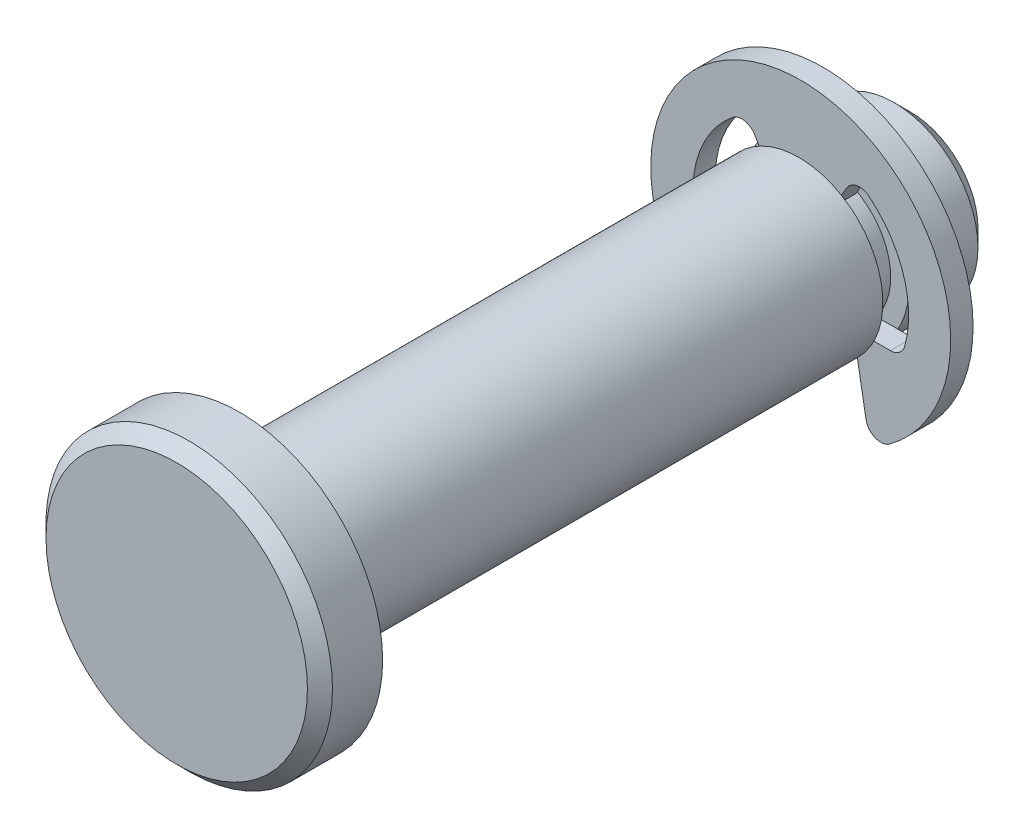
ISO-10303-21;
HEADER;
FILE_DESCRIPTION(('STEP AP214'),'2;1');
FILE_NAME('part.step','',(''),(''),'','','');
FILE_SCHEMA(('AUTOMOTIVE_DESIGN { 1 0 10303 214 1 1 1 1 }'));
ENDSEC;
DATA;
#1=APPLICATION_CONTEXT('core data for automotive mechanical design processes');
#2=APPLICATION_PROTOCOL_DEFINITION('international standard','automotive_design',2000,#1);
#3=PRODUCT_CONTEXT('',#1,'mechanical');
#4=PRODUCT('Part','Part','',(#3));
#5=PRODUCT_RELATED_PRODUCT_CATEGORY('part','',(#4));
#6=PRODUCT_DEFINITION_FORMATION('','',#4);
#7=PRODUCT_DEFINITION_CONTEXT('part definition',#1,'design');
#8=PRODUCT_DEFINITION('design','',#6,#7);
#9=PRODUCT_DEFINITION_SHAPE('','',#8);
#10=(LENGTH_UNIT() NAMED_UNIT(*) SI_UNIT(.MILLI.,.METRE.));
#11=(NAMED_UNIT(*) PLANE_ANGLE_UNIT() SI_UNIT($,.RADIAN.));
#12=(NAMED_UNIT(*) SI_UNIT($,.STERADIAN.) SOLID_ANGLE_UNIT());
#13=UNCERTAINTY_MEASURE_WITH_UNIT(LENGTH_MEASURE(1.E-05),#10,'distance_accuracy_value','');
#14=(GEOMETRIC_REPRESENTATION_CONTEXT(3) GLOBAL_UNCERTAINTY_ASSIGNED_CONTEXT((#13)) GLOBAL_UNIT_ASSIGNED_CONTEXT((#10,
#11,#12)) REPRESENTATION_CONTEXT('',''));
#15=CARTESIAN_POINT('',(0.,0.,0.));
#16=DIRECTION('',(0.,0.,1.));
#17=DIRECTION('',(1.,0.,0.));
#18=AXIS2_PLACEMENT_3D('',#15,#16,#17);
#19=CARTESIAN_POINT('',(0.,0.,-6.4008));
#20=DIRECTION('',(0.,0.,1.));
#21=DIRECTION('',(1.,0.,0.));
#22=AXIS2_PLACEMENT_3D('',#19,#20,#21);
#23=PLANE('',#22);
#24=DIRECTION('',(-0.173648177666931,0.984807753012208,0.));
#25=VECTOR('',#24,1.);
#26=CARTESIAN_POINT('',(1.25692963982568,0.22163060835344,-6.4008));
#27=LINE('',#26,#25);
#28=CARTESIAN_POINT('',(1.85256069501915,-3.15636096616503,-6.4008));
#29=VERTEX_POINT('',#28);
#30=CARTESIAN_POINT('',(1.49352,-1.12014,-6.4008));
#31=VERTEX_POINT('',#30);
#32=EDGE_CURVE('E203',#29,#31,#27,.T.);
#33=ORIENTED_EDGE('',*,*,#32,.F.);
#34=CARTESIAN_POINT('',(2.2715471535382,-3.08248234897663,-6.4008));
#35=DIRECTION('',(0.,0.,1.));
#36=DIRECTION('',(1.,0.,0.));
#37=AXIS2_PLACEMENT_3D('',#34,#35,#36);
#38=CIRCLE('',#37,0.42545);
#39=CARTESIAN_POINT('',(2.52394128170911,-3.42498038775182,-6.4008));
#40=VERTEX_POINT('',#39);
#41=EDGE_CURVE('E257',#29,#40,#38,.T.);
#42=ORIENTED_EDGE('',*,*,#41,.T.);
#43=CARTESIAN_POINT('',(0.,0.,-6.4008));
#44=DIRECTION('',(0.,0.,1.));
#45=DIRECTION('',(1.,0.,0.));
#46=AXIS2_PLACEMENT_3D('',#43,#44,#45);
#47=CIRCLE('',#46,4.2545);
#48=CARTESIAN_POINT('',(-2.52394128170911,-3.42498038775182,-6.4008));
#49=VERTEX_POINT('',#48);
#50=EDGE_CURVE('E183',#40,#49,#47,.T.);
#51=ORIENTED_EDGE('',*,*,#50,.T.);
#52=CARTESIAN_POINT('',(-2.2715471535382,-3.08248234897663,-6.4008));
#53=DIRECTION('',(0.,0.,1.));
#54=DIRECTION('',(1.,0.,0.));
#55=AXIS2_PLACEMENT_3D('',#52,#53,#54);
#56=CIRCLE('',#55,0.42545);
#57=CARTESIAN_POINT('',(-1.85256069501915,-3.15636096616503,-6.4008));
#58=VERTEX_POINT('',#57);
#59=EDGE_CURVE('E255',#49,#58,#56,.T.);
#60=ORIENTED_EDGE('',*,*,#59,.T.);
#61=DIRECTION('',(-0.173648177666931,-0.984807753012208,0.));
#62=VECTOR('',#61,1.);
#63=CARTESIAN_POINT('',(-1.25692963982568,0.22163060835344,-6.4008));
#64=LINE('',#63,#62);
#65=CARTESIAN_POINT('',(-1.49352,-1.12014,-6.4008));
#66=VERTEX_POINT('',#65);
#67=EDGE_CURVE('E199',#66,#58,#64,.T.);
#68=ORIENTED_EDGE('',*,*,#67,.F.);
#69=DIRECTION('',(1.,0.,0.));
#70=VECTOR('',#69,1.);
#71=CARTESIAN_POINT('',(0.,-1.12014,-6.4008));
#72=LINE('',#71,#70);
#73=CARTESIAN_POINT('',(-2.54203626378539,-1.12014,-6.4008));
#74=VERTEX_POINT('',#73);
#75=EDGE_CURVE('E190',#74,#66,#72,.T.);
#76=ORIENTED_EDGE('',*,*,#75,.F.);
#77=CARTESIAN_POINT('',(-2.54203626378539,-0.69469,-6.4008));
#78=DIRECTION('',(0.,0.,1.));
#79=DIRECTION('',(1.,0.,0.));
#80=AXIS2_PLACEMENT_3D('',#77,#78,#79);
#81=CIRCLE('',#80,0.42545);
#82=CARTESIAN_POINT('',(-2.95243729914352,-0.806844771084337,-6.4008));
#83=VERTEX_POINT('',#82);
#84=EDGE_CURVE('E55',#74,#83,#81,.F.);
#85=ORIENTED_EDGE('',*,*,#84,.T.);
#86=CARTESIAN_POINT('',(0.,0.,-6.4008));
#87=DIRECTION('',(0.,0.,1.));
#88=DIRECTION('',(1.,0.,0.));
#89=AXIS2_PLACEMENT_3D('',#86,#87,#88);
#90=CIRCLE('',#89,3.0607);
#91=CARTESIAN_POINT('',(-1.93820951958955,2.36880314677528,-6.4008));
#92=VERTEX_POINT('',#91);
#93=EDGE_CURVE('E215',#92,#83,#90,.T.);
#94=ORIENTED_EDGE('',*,*,#93,.F.);
#95=CARTESIAN_POINT('',(-1.66879035400345,2.03952968031481,-6.4008));
#96=DIRECTION('',(0.,0.,1.));
#97=DIRECTION('',(1.,0.,0.));
#98=AXIS2_PLACEMENT_3D('',#95,#96,#97);
#99=CIRCLE('',#98,0.42545);
#100=CARTESIAN_POINT('',(-1.30033984596336,2.25225468031482,-6.4008));
#101=VERTEX_POINT('',#100);
#102=EDGE_CURVE('E187',#92,#101,#99,.F.);
#103=ORIENTED_EDGE('',*,*,#102,.T.);
#104=DIRECTION('',(-0.500000000000002,0.866025403784438,0.));
#105=VECTOR('',#104,1.);
#106=CARTESIAN_POINT('',(0.,0.,-6.4008));
#107=LINE('',#106,#105);
#108=CARTESIAN_POINT('',(-0.933450000000003,1.61678282632517,-6.4008));
#109=VERTEX_POINT('',#108);
#110=EDGE_CURVE('E179',#109,#101,#107,.T.);
#111=ORIENTED_EDGE('',*,*,#110,.F.);
#112=DIRECTION('',(1.,0.,0.));
#113=VECTOR('',#112,1.);
#114=CARTESIAN_POINT('',(-0.933450000000003,1.61678282632517,-6.4008));
#115=LINE('',#114,#113);
#116=CARTESIAN_POINT('',(0.933450000000003,1.61678282632517,-6.4008));
#117=VERTEX_POINT('',#116);
#118=EDGE_CURVE('E163',#109,#117,#115,.T.);
#119=ORIENTED_EDGE('',*,*,#118,.T.);
#120=DIRECTION('',(-0.500000000000002,-0.866025403784438,0.));
#121=VECTOR('',#120,1.);
#122=CARTESIAN_POINT('',(0.,0.,-6.4008));
#123=LINE('',#122,#121);
#124=CARTESIAN_POINT('',(1.30033984596336,2.25225468031482,-6.4008));
#125=VERTEX_POINT('',#124);
#126=EDGE_CURVE('E213',#125,#117,#123,.T.);
#127=ORIENTED_EDGE('',*,*,#126,.F.);
#128=CARTESIAN_POINT('',(1.66879035400345,2.03952968031481,-6.4008));
#129=DIRECTION('',(0.,0.,1.));
#130=DIRECTION('',(1.,0.,0.));
#131=AXIS2_PLACEMENT_3D('',#128,#129,#130);
#132=CIRCLE('',#131,0.42545);
#133=CARTESIAN_POINT('',(1.93820951958955,2.36880314677528,-6.4008));
#134=VERTEX_POINT('',#133);
#135=EDGE_CURVE('E272',#125,#134,#132,.F.);
#136=ORIENTED_EDGE('',*,*,#135,.T.);
#137=CARTESIAN_POINT('',(0.,0.,-6.4008));
#138=DIRECTION('',(0.,0.,1.));
#139=DIRECTION('',(1.,0.,0.));
#140=AXIS2_PLACEMENT_3D('',#137,#138,#139);
#141=CIRCLE('',#140,3.0607);
#142=CARTESIAN_POINT('',(2.95243729914352,-0.806844771084337,-6.4008));
#143=VERTEX_POINT('',#142);
#144=EDGE_CURVE('E218',#143,#134,#141,.T.);
#145=ORIENTED_EDGE('',*,*,#144,.F.);
#146=CARTESIAN_POINT('',(2.54203626378539,-0.69469,-6.4008));
#147=DIRECTION('',(0.,0.,1.));
#148=DIRECTION('',(1.,0.,0.));
#149=AXIS2_PLACEMENT_3D('',#146,#147,#148);
#150=CIRCLE('',#149,0.42545);
#151=CARTESIAN_POINT('',(2.54203626378539,-1.12014,-6.4008));
#152=VERTEX_POINT('',#151);
#153=EDGE_CURVE('E268',#143,#152,#150,.F.);
#154=ORIENTED_EDGE('',*,*,#153,.T.);
#155=DIRECTION('',(1.,0.,0.));
#156=VECTOR('',#155,1.);
#157=CARTESIAN_POINT('',(0.,-1.12014,-6.4008));
#158=LINE('',#157,#156);
#159=EDGE_CURVE('E208',#31,#152,#158,.T.);
#160=ORIENTED_EDGE('',*,*,#159,.F.);
#161=EDGE_LOOP('',(#33,#42,#51,#60,#68,#76,#85,#94,#103,#111,#119,#127,#136,#145,#154,#160));
#162=FACE_BOUND('',#161,.T.);
#163=ADVANCED_FACE('F47',(#162),#23,.T.);
#164=CARTESIAN_POINT('',(0.,0.,-7.0358));
#165=DIRECTION('',(0.,0.,1.));
#166=DIRECTION('',(1.,0.,0.));
#167=AXIS2_PLACEMENT_3D('',#164,#165,#166);
#168=PLANE('',#167);
#169=CARTESIAN_POINT('',(0.,0.,-7.0358));
#170=DIRECTION('',(0.,0.,1.));
#171=DIRECTION('',(1.,0.,0.));
#172=AXIS2_PLACEMENT_3D('',#169,#170,#171);
#173=CIRCLE('',#172,4.2545);
#174=CARTESIAN_POINT('',(2.52394128170911,-3.42498038775182,-7.0358));
#175=VERTEX_POINT('',#174);
#176=CARTESIAN_POINT('',(-2.52394128170911,-3.42498038775182,-7.0358));
#177=VERTEX_POINT('',#176);
#178=EDGE_CURVE('E221',#175,#177,#173,.T.);
#179=ORIENTED_EDGE('',*,*,#178,.F.);
#180=CARTESIAN_POINT('',(2.2715471535382,-3.08248234897663,-7.0358));
#181=DIRECTION('',(0.,0.,1.));
#182=DIRECTION('',(1.,0.,0.));
#183=AXIS2_PLACEMENT_3D('',#180,#181,#182);
#184=CIRCLE('',#183,0.42545);
#185=CARTESIAN_POINT('',(1.85256069501915,-3.15636096616503,-7.0358));
#186=VERTEX_POINT('',#185);
#187=EDGE_CURVE('E265',#175,#186,#184,.F.);
#188=ORIENTED_EDGE('',*,*,#187,.T.);
#189=DIRECTION('',(-0.173648177666931,0.984807753012208,0.));
#190=VECTOR('',#189,1.);
#191=CARTESIAN_POINT('',(1.25692963982568,0.22163060835344,-7.0358));
#192=LINE('',#191,#190);
#193=CARTESIAN_POINT('',(1.49352,-1.12014,-7.0358));
#194=VERTEX_POINT('',#193);
#195=EDGE_CURVE('E201',#186,#194,#192,.T.);
#196=ORIENTED_EDGE('',*,*,#195,.T.);
#197=DIRECTION('',(1.,0.,0.));
#198=VECTOR('',#197,1.);
#199=CARTESIAN_POINT('',(0.,-1.12014,-7.0358));
#200=LINE('',#199,#198);
#201=CARTESIAN_POINT('',(2.54203626378539,-1.12014,-7.0358));
#202=VERTEX_POINT('',#201);
#203=EDGE_CURVE('E205',#194,#202,#200,.T.);
#204=ORIENTED_EDGE('',*,*,#203,.T.);
#205=CARTESIAN_POINT('',(2.54203626378539,-0.69469,-7.0358));
#206=DIRECTION('',(0.,0.,1.));
#207=DIRECTION('',(1.,0.,0.));
#208=AXIS2_PLACEMENT_3D('',#205,#206,#207);
#209=CIRCLE('',#208,0.42545);
#210=CARTESIAN_POINT('',(2.95243729914352,-0.806844771084337,-7.0358));
#211=VERTEX_POINT('',#210);
#212=EDGE_CURVE('E270',#202,#211,#209,.T.);
#213=ORIENTED_EDGE('',*,*,#212,.T.);
#214=CARTESIAN_POINT('',(0.,0.,-7.0358));
#215=DIRECTION('',(0.,0.,1.));
#216=DIRECTION('',(1.,0.,0.));
#217=AXIS2_PLACEMENT_3D('',#214,#215,#216);
#218=CIRCLE('',#217,3.0607);
#219=CARTESIAN_POINT('',(1.93820951958955,2.36880314677528,-7.0358));
#220=VERTEX_POINT('',#219);
#221=EDGE_CURVE('E229',#211,#220,#218,.T.);
#222=ORIENTED_EDGE('',*,*,#221,.T.);
#223=CARTESIAN_POINT('',(1.66879035400345,2.03952968031481,-7.0358));
#224=DIRECTION('',(0.,0.,1.));
#225=DIRECTION('',(1.,0.,0.));
#226=AXIS2_PLACEMENT_3D('',#223,#224,#225);
#227=CIRCLE('',#226,0.42545);
#228=CARTESIAN_POINT('',(1.30033984596336,2.25225468031482,-7.0358));
#229=VERTEX_POINT('',#228);
#230=EDGE_CURVE('E274',#220,#229,#227,.T.);
#231=ORIENTED_EDGE('',*,*,#230,.T.);
#232=DIRECTION('',(-0.500000000000002,-0.866025403784438,0.));
#233=VECTOR('',#232,1.);
#234=CARTESIAN_POINT('',(0.,0.,-7.0358));
#235=LINE('',#234,#233);
#236=CARTESIAN_POINT('',(0.933450000000003,1.61678282632517,-7.0358));
#237=VERTEX_POINT('',#236);
#238=EDGE_CURVE('E211',#229,#237,#235,.T.);
#239=ORIENTED_EDGE('',*,*,#238,.T.);
#240=DIRECTION('',(-1.,0.,0.));
#241=VECTOR('',#240,1.);
#242=CARTESIAN_POINT('',(-0.933450000000003,1.61678282632517,-7.0358));
#243=LINE('',#242,#241);
#244=CARTESIAN_POINT('',(-0.933450000000003,1.61678282632517,-7.0358));
#245=VERTEX_POINT('',#244);
#246=EDGE_CURVE('E174',#237,#245,#243,.T.);
#247=ORIENTED_EDGE('',*,*,#246,.T.);
#248=DIRECTION('',(-0.500000000000002,0.866025403784438,0.));
#249=VECTOR('',#248,1.);
#250=CARTESIAN_POINT('',(0.,0.,-7.0358));
#251=LINE('',#250,#249);
#252=CARTESIAN_POINT('',(-1.30033984596336,2.25225468031482,-7.0358));
#253=VERTEX_POINT('',#252);
#254=EDGE_CURVE('E182',#245,#253,#251,.T.);
#255=ORIENTED_EDGE('',*,*,#254,.T.);
#256=CARTESIAN_POINT('',(-1.66879035400345,2.03952968031481,-7.0358));
#257=DIRECTION('',(0.,0.,1.));
#258=DIRECTION('',(1.,0.,0.));
#259=AXIS2_PLACEMENT_3D('',#256,#257,#258);
#260=CIRCLE('',#259,0.42545);
#261=CARTESIAN_POINT('',(-1.93820951958955,2.36880314677528,-7.0358));
#262=VERTEX_POINT('',#261);
#263=EDGE_CURVE('E277',#253,#262,#260,.T.);
#264=ORIENTED_EDGE('',*,*,#263,.T.);
#265=CARTESIAN_POINT('',(0.,0.,-7.0358));
#266=DIRECTION('',(0.,0.,1.));
#267=DIRECTION('',(1.,0.,0.));
#268=AXIS2_PLACEMENT_3D('',#265,#266,#267);
#269=CIRCLE('',#268,3.0607);
#270=CARTESIAN_POINT('',(-2.95243729914352,-0.806844771084337,-7.0358));
#271=VERTEX_POINT('',#270);
#272=EDGE_CURVE('E226',#262,#271,#269,.T.);
#273=ORIENTED_EDGE('',*,*,#272,.T.);
#274=CARTESIAN_POINT('',(-2.54203626378539,-0.69469,-7.0358));
#275=DIRECTION('',(0.,0.,1.));
#276=DIRECTION('',(1.,0.,0.));
#277=AXIS2_PLACEMENT_3D('',#274,#275,#276);
#278=CIRCLE('',#277,0.42545);
#279=CARTESIAN_POINT('',(-2.54203626378539,-1.12014,-7.0358));
#280=VERTEX_POINT('',#279);
#281=EDGE_CURVE('E12',#271,#280,#278,.T.);
#282=ORIENTED_EDGE('',*,*,#281,.T.);
#283=DIRECTION('',(1.,0.,0.));
#284=VECTOR('',#283,1.);
#285=CARTESIAN_POINT('',(0.,-1.12014,-7.0358));
#286=LINE('',#285,#284);
#287=CARTESIAN_POINT('',(-1.49352,-1.12014,-7.0358));
#288=VERTEX_POINT('',#287);
#289=EDGE_CURVE('E188',#280,#288,#286,.T.);
#290=ORIENTED_EDGE('',*,*,#289,.T.);
#291=DIRECTION('',(-0.173648177666931,-0.984807753012208,0.));
#292=VECTOR('',#291,1.);
#293=CARTESIAN_POINT('',(-1.25692963982568,0.22163060835344,-7.0358));
#294=LINE('',#293,#292);
#295=CARTESIAN_POINT('',(-1.85256069501915,-3.15636096616503,-7.0358));
#296=VERTEX_POINT('',#295);
#297=EDGE_CURVE('E197',#288,#296,#294,.T.);
#298=ORIENTED_EDGE('',*,*,#297,.T.);
#299=CARTESIAN_POINT('',(-2.2715471535382,-3.08248234897663,-7.0358));
#300=DIRECTION('',(0.,0.,1.));
#301=DIRECTION('',(1.,0.,0.));
#302=AXIS2_PLACEMENT_3D('',#299,#300,#301);
#303=CIRCLE('',#302,0.42545);
#304=EDGE_CURVE('E69',#296,#177,#303,.F.);
#305=ORIENTED_EDGE('',*,*,#304,.T.);
#306=EDGE_LOOP('',(#179,#188,#196,#204,#213,#222,#231,#239,#247,#255,#264,#273,#282,#290,#298,#305));
#307=FACE_BOUND('',#306,.T.);
#308=ADVANCED_FACE('F290',(#307),#168,.F.);
#309=CARTESIAN_POINT('',(0.,0.,-6.4008));
#310=DIRECTION('',(0.,0.,-1.));
#311=DIRECTION('',(-1.,0.,0.));
#312=AXIS2_PLACEMENT_3D('',#309,#310,#311);
#313=CYLINDRICAL_SURFACE('',#312,4.2545);
#314=ORIENTED_EDGE('',*,*,#50,.F.);
#315=DIRECTION('',(0.,0.,-1.));
#316=VECTOR('',#315,1.);
#317=CARTESIAN_POINT('',(2.52394128170911,-3.42498038775182,-6.4008));
#318=LINE('',#317,#316);
#319=EDGE_CURVE('E262',#40,#175,#318,.T.);
#320=ORIENTED_EDGE('',*,*,#319,.T.);
#321=ORIENTED_EDGE('',*,*,#178,.T.);
#322=DIRECTION('',(0.,0.,-1.));
#323=VECTOR('',#322,1.);
#324=CARTESIAN_POINT('',(-2.52394128170911,-3.42498038775182,-6.4008));
#325=LINE('',#324,#323);
#326=EDGE_CURVE('E259',#177,#49,#325,.F.);
#327=ORIENTED_EDGE('',*,*,#326,.T.);
#328=EDGE_LOOP('',(#314,#320,#321,#327));
#329=FACE_BOUND('',#328,.T.);
#330=ADVANCED_FACE('F330',(#329),#313,.T.);
#331=CARTESIAN_POINT('',(-1.49352,-1.12014,-9.525));
#332=DIRECTION('',(-0.984807753012208,0.173648177666931,0.));
#333=DIRECTION('',(-0.173648177666931,-0.984807753012208,0.));
#334=AXIS2_PLACEMENT_3D('',#331,#332,#333);
#335=PLANE('',#334);
#336=ORIENTED_EDGE('',*,*,#67,.T.);
#337=DIRECTION('',(0.,0.,-1.));
#338=VECTOR('',#337,1.);
#339=CARTESIAN_POINT('',(-1.85256069501915,-3.15636096616503,-9.525));
#340=LINE('',#339,#338);
#341=EDGE_CURVE('E62',#58,#296,#340,.T.);
#342=ORIENTED_EDGE('',*,*,#341,.T.);
#343=ORIENTED_EDGE('',*,*,#297,.F.);
#344=DIRECTION('',(0.,0.,1.));
#345=VECTOR('',#344,1.);
#346=CARTESIAN_POINT('',(-1.49352,-1.12014,-9.525));
#347=LINE('',#346,#345);
#348=EDGE_CURVE('E295',#288,#66,#347,.T.);
#349=ORIENTED_EDGE('',*,*,#348,.T.);
#350=EDGE_LOOP('',(#336,#342,#343,#349));
#351=FACE_BOUND('',#350,.T.);
#352=ADVANCED_FACE('F335',(#351),#335,.F.);
#353=CARTESIAN_POINT('',(-1.53035,2.65064395336303,-9.525));
#354=DIRECTION('',(0.866025403784438,0.500000000000002,0.));
#355=DIRECTION('',(-0.500000000000002,0.866025403784438,0.));
#356=AXIS2_PLACEMENT_3D('',#353,#354,#355);
#357=PLANE('',#356);
#358=ORIENTED_EDGE('',*,*,#110,.T.);
#359=DIRECTION('',(0.,0.,-1.));
#360=VECTOR('',#359,1.);
#361=CARTESIAN_POINT('',(-1.30033984596336,2.25225468031481,-7.0358));
#362=LINE('',#361,#360);
#363=EDGE_CURVE('E247',#101,#253,#362,.T.);
#364=ORIENTED_EDGE('',*,*,#363,.T.);
#365=ORIENTED_EDGE('',*,*,#254,.F.);
#366=DIRECTION('',(0.,0.,-1.));
#367=VECTOR('',#366,1.);
#368=CARTESIAN_POINT('',(-0.933450000000003,1.61678282632517,-6.4008));
#369=LINE('',#368,#367);
#370=EDGE_CURVE('E167',#245,#109,#369,.F.);
#371=ORIENTED_EDGE('',*,*,#370,.T.);
#372=EDGE_LOOP('',(#358,#364,#365,#371));
#373=FACE_BOUND('',#372,.T.);
#374=ADVANCED_FACE('F178',(#373),#357,.F.);
#375=CARTESIAN_POINT('',(0.,0.,-9.525));
#376=DIRECTION('',(0.,0.,1.));
#377=DIRECTION('',(1.,0.,0.));
#378=AXIS2_PLACEMENT_3D('',#375,#376,#377);
#379=CYLINDRICAL_SURFACE('',#378,3.0607);
#380=ORIENTED_EDGE('',*,*,#272,.F.);
#381=DIRECTION('',(0.,0.,1.));
#382=VECTOR('',#381,1.);
#383=CARTESIAN_POINT('',(-1.93820951958955,2.36880314677528,-9.525));
#384=LINE('',#383,#382);
#385=EDGE_CURVE('E244',#262,#92,#384,.T.);
#386=ORIENTED_EDGE('',*,*,#385,.T.);
#387=ORIENTED_EDGE('',*,*,#93,.T.);
#388=DIRECTION('',(0.,0.,1.));
#389=VECTOR('',#388,1.);
#390=CARTESIAN_POINT('',(-2.95243729914352,-0.806844771084337,-9.525));
#391=LINE('',#390,#389);
#392=EDGE_CURVE('E242',#83,#271,#391,.F.);
#393=ORIENTED_EDGE('',*,*,#392,.T.);
#394=EDGE_LOOP('',(#380,#386,#387,#393));
#395=FACE_BOUND('',#394,.T.);
#396=ADVANCED_FACE('F285',(#395),#379,.F.);
#397=CARTESIAN_POINT('',(-2.84836284036989,-1.12014,-9.525));
#398=DIRECTION('',(0.,-1.,0.));
#399=DIRECTION('',(0.,0.,-1.));
#400=AXIS2_PLACEMENT_3D('',#397,#398,#399);
#401=PLANE('',#400);
#402=ORIENTED_EDGE('',*,*,#289,.F.);
#403=DIRECTION('',(0.,0.,-1.));
#404=VECTOR('',#403,1.);
#405=CARTESIAN_POINT('',(-2.54203626378539,-1.12014,-6.4008));
#406=LINE('',#405,#404);
#407=EDGE_CURVE('E249',#280,#74,#406,.F.);
#408=ORIENTED_EDGE('',*,*,#407,.T.);
#409=ORIENTED_EDGE('',*,*,#75,.T.);
#410=ORIENTED_EDGE('',*,*,#348,.F.);
#411=EDGE_LOOP('',(#402,#408,#409,#410));
#412=FACE_BOUND('',#411,.T.);
#413=ADVANCED_FACE('F293',(#412),#401,.F.);
#414=CARTESIAN_POINT('',(0.,0.,-9.525));
#415=DIRECTION('',(0.,0.,1.));
#416=DIRECTION('',(1.,0.,0.));
#417=AXIS2_PLACEMENT_3D('',#414,#415,#416);
#418=CYLINDRICAL_SURFACE('',#417,3.0607);
#419=ORIENTED_EDGE('',*,*,#221,.F.);
#420=DIRECTION('',(0.,0.,1.));
#421=VECTOR('',#420,1.);
#422=CARTESIAN_POINT('',(2.95243729914352,-0.806844771084337,-9.525));
#423=LINE('',#422,#421);
#424=EDGE_CURVE('E234',#211,#143,#423,.T.);
#425=ORIENTED_EDGE('',*,*,#424,.T.);
#426=ORIENTED_EDGE('',*,*,#144,.T.);
#427=DIRECTION('',(0.,0.,1.));
#428=VECTOR('',#427,1.);
#429=CARTESIAN_POINT('',(1.93820951958955,2.36880314677528,-9.525));
#430=LINE('',#429,#428);
#431=EDGE_CURVE('E232',#134,#220,#430,.F.);
#432=ORIENTED_EDGE('',*,*,#431,.T.);
#433=EDGE_LOOP('',(#419,#425,#426,#432));
#434=FACE_BOUND('',#433,.T.);
#435=ADVANCED_FACE('F309',(#434),#418,.F.);
#436=CARTESIAN_POINT('',(1.49352,-1.12014,-9.525));
#437=DIRECTION('',(0.,-1.,0.));
#438=DIRECTION('',(0.,0.,-1.));
#439=AXIS2_PLACEMENT_3D('',#436,#437,#438);
#440=PLANE('',#439);
#441=ORIENTED_EDGE('',*,*,#159,.T.);
#442=DIRECTION('',(0.,0.,-1.));
#443=VECTOR('',#442,1.);
#444=CARTESIAN_POINT('',(2.54203626378539,-1.12014,-7.0358));
#445=LINE('',#444,#443);
#446=EDGE_CURVE('E237',#152,#202,#445,.T.);
#447=ORIENTED_EDGE('',*,*,#446,.T.);
#448=ORIENTED_EDGE('',*,*,#203,.F.);
#449=DIRECTION('',(0.,0.,1.));
#450=VECTOR('',#449,1.);
#451=CARTESIAN_POINT('',(1.49352,-1.12014,-9.525));
#452=LINE('',#451,#450);
#453=EDGE_CURVE('E192',#194,#31,#452,.T.);
#454=ORIENTED_EDGE('',*,*,#453,.T.);
#455=EDGE_LOOP('',(#441,#447,#448,#454));
#456=FACE_BOUND('',#455,.T.);
#457=ADVANCED_FACE('F319',(#456),#440,.F.);
#458=CARTESIAN_POINT('',(1.49352,-1.12014,-9.525));
#459=DIRECTION('',(0.984807753012208,0.173648177666931,0.));
#460=DIRECTION('',(-0.173648177666931,0.984807753012208,0.));
#461=AXIS2_PLACEMENT_3D('',#458,#459,#460);
#462=PLANE('',#461);
#463=ORIENTED_EDGE('',*,*,#195,.F.);
#464=DIRECTION('',(0.,0.,-1.));
#465=VECTOR('',#464,1.);
#466=CARTESIAN_POINT('',(1.85256069501915,-3.15636096616503,-9.525));
#467=LINE('',#466,#465);
#468=EDGE_CURVE('E252',#186,#29,#467,.F.);
#469=ORIENTED_EDGE('',*,*,#468,.T.);
#470=ORIENTED_EDGE('',*,*,#32,.T.);
#471=ORIENTED_EDGE('',*,*,#453,.F.);
#472=EDGE_LOOP('',(#463,#469,#470,#471));
#473=FACE_BOUND('',#472,.T.);
#474=ADVANCED_FACE('F324',(#473),#462,.F.);
#475=CARTESIAN_POINT('',(0.,0.,-9.525));
#476=DIRECTION('',(-0.866025403784438,0.500000000000002,0.));
#477=DIRECTION('',(-0.500000000000002,-0.866025403784438,0.));
#478=AXIS2_PLACEMENT_3D('',#475,#476,#477);
#479=PLANE('',#478);
#480=ORIENTED_EDGE('',*,*,#238,.F.);
#481=DIRECTION('',(0.,0.,-1.));
#482=VECTOR('',#481,1.);
#483=CARTESIAN_POINT('',(1.30033984596336,2.25225468031481,-6.4008));
#484=LINE('',#483,#482);
#485=EDGE_CURVE('E239',#229,#125,#484,.F.);
#486=ORIENTED_EDGE('',*,*,#485,.T.);
#487=ORIENTED_EDGE('',*,*,#126,.T.);
#488=DIRECTION('',(0.,0.,-1.));
#489=VECTOR('',#488,1.);
#490=CARTESIAN_POINT('',(0.933450000000003,1.61678282632517,-6.4008));
#491=LINE('',#490,#489);
#492=EDGE_CURVE('E170',#117,#237,#491,.T.);
#493=ORIENTED_EDGE('',*,*,#492,.T.);
#494=EDGE_LOOP('',(#480,#486,#487,#493));
#495=FACE_BOUND('',#494,.T.);
#496=ADVANCED_FACE('F302',(#495),#479,.F.);
#497=CARTESIAN_POINT('',(-0.933450000000003,1.61678282632517,-8.91938015772281));
#498=DIRECTION('',(0.,-1.,0.));
#499=DIRECTION('',(0.,0.,-1.));
#500=AXIS2_PLACEMENT_3D('',#497,#498,#499);
#501=PLANE('',#500);
#502=ORIENTED_EDGE('',*,*,#246,.F.);
#503=ORIENTED_EDGE('',*,*,#492,.F.);
#504=ORIENTED_EDGE('',*,*,#118,.F.);
#505=ORIENTED_EDGE('',*,*,#370,.F.);
#506=EDGE_LOOP('',(#502,#503,#504,#505));
#507=FACE_BOUND('',#506,.T.);
#508=ADVANCED_FACE('F166',(#507),#501,.T.);
#509=CARTESIAN_POINT('',(2.54203626378539,-0.69469,-9.525));
#510=DIRECTION('',(0.,0.,1.));
#511=DIRECTION('',(1.,0.,0.));
#512=AXIS2_PLACEMENT_3D('',#509,#510,#511);
#513=CYLINDRICAL_SURFACE('',#512,0.42545);
#514=ORIENTED_EDGE('',*,*,#212,.F.);
#515=ORIENTED_EDGE('',*,*,#446,.F.);
#516=ORIENTED_EDGE('',*,*,#153,.F.);
#517=ORIENTED_EDGE('',*,*,#424,.F.);
#518=EDGE_LOOP('',(#514,#515,#516,#517));
#519=FACE_BOUND('',#518,.T.);
#520=ADVANCED_FACE('F315',(#519),#513,.F.);
#521=CARTESIAN_POINT('',(1.66879035400345,2.03952968031481,-9.525));
#522=DIRECTION('',(0.,0.,1.));
#523=DIRECTION('',(1.,0.,0.));
#524=AXIS2_PLACEMENT_3D('',#521,#522,#523);
#525=CYLINDRICAL_SURFACE('',#524,0.42545);
#526=ORIENTED_EDGE('',*,*,#230,.F.);
#527=ORIENTED_EDGE('',*,*,#431,.F.);
#528=ORIENTED_EDGE('',*,*,#135,.F.);
#529=ORIENTED_EDGE('',*,*,#485,.F.);
#530=EDGE_LOOP('',(#526,#527,#528,#529));
#531=FACE_BOUND('',#530,.T.);
#532=ADVANCED_FACE('F312',(#531),#525,.F.);
#533=CARTESIAN_POINT('',(-1.66879035400345,2.03952968031481,-9.525));
#534=DIRECTION('',(0.,0.,1.));
#535=DIRECTION('',(1.,0.,0.));
#536=AXIS2_PLACEMENT_3D('',#533,#534,#535);
#537=CYLINDRICAL_SURFACE('',#536,0.42545);
#538=ORIENTED_EDGE('',*,*,#263,.F.);
#539=ORIENTED_EDGE('',*,*,#363,.F.);
#540=ORIENTED_EDGE('',*,*,#102,.F.);
#541=ORIENTED_EDGE('',*,*,#385,.F.);
#542=EDGE_LOOP('',(#538,#539,#540,#541));
#543=FACE_BOUND('',#542,.T.);
#544=ADVANCED_FACE('F358',(#543),#537,.F.);
#545=CARTESIAN_POINT('',(-2.54203626378539,-0.69469,-9.525));
#546=DIRECTION('',(0.,0.,1.));
#547=DIRECTION('',(1.,0.,0.));
#548=AXIS2_PLACEMENT_3D('',#545,#546,#547);
#549=CYLINDRICAL_SURFACE('',#548,0.42545);
#550=ORIENTED_EDGE('',*,*,#281,.F.);
#551=ORIENTED_EDGE('',*,*,#392,.F.);
#552=ORIENTED_EDGE('',*,*,#84,.F.);
#553=ORIENTED_EDGE('',*,*,#407,.F.);
#554=EDGE_LOOP('',(#550,#551,#552,#553));
#555=FACE_BOUND('',#554,.T.);
#556=ADVANCED_FACE('F288',(#555),#549,.F.);
#557=CARTESIAN_POINT('',(2.2715471535382,-3.08248234897663,-6.4008));
#558=DIRECTION('',(0.,0.,-1.));
#559=DIRECTION('',(-1.,0.,0.));
#560=AXIS2_PLACEMENT_3D('',#557,#558,#559);
#561=CYLINDRICAL_SURFACE('',#560,0.42545);
#562=ORIENTED_EDGE('',*,*,#187,.F.);
#563=ORIENTED_EDGE('',*,*,#319,.F.);
#564=ORIENTED_EDGE('',*,*,#41,.F.);
#565=ORIENTED_EDGE('',*,*,#468,.F.);
#566=EDGE_LOOP('',(#562,#563,#564,#565));
#567=FACE_BOUND('',#566,.T.);
#568=ADVANCED_FACE('F333',(#567),#561,.T.);
#569=CARTESIAN_POINT('',(-2.2715471535382,-3.08248234897663,-6.4008));
#570=DIRECTION('',(0.,0.,-1.));
#571=DIRECTION('',(-1.,0.,0.));
#572=AXIS2_PLACEMENT_3D('',#569,#570,#571);
#573=CYLINDRICAL_SURFACE('',#572,0.42545);
#574=ORIENTED_EDGE('',*,*,#304,.F.);
#575=ORIENTED_EDGE('',*,*,#341,.F.);
#576=ORIENTED_EDGE('',*,*,#59,.F.);
#577=ORIENTED_EDGE('',*,*,#326,.F.);
#578=EDGE_LOOP('',(#574,#575,#576,#577));
#579=FACE_BOUND('',#578,.T.);
#580=ADVANCED_FACE('F49',(#579),#573,.T.);
#581=CLOSED_SHELL('',(#163,#308,#330,#352,#374,#396,#413,#435,#457,#474,#496,#508,#520,#532,
#544,#556,#568,#580));
#582=MANIFOLD_SOLID_BREP('B2',#581);
#583=CARTESIAN_POINT('',(0.,0.,9.525));
#584=DIRECTION('',(0.,0.,-1.));
#585=DIRECTION('',(-1.,0.,0.));
#586=AXIS2_PLACEMENT_3D('',#583,#584,#585);
#587=CYLINDRICAL_SURFACE('',#586,2.38125);
#588=CARTESIAN_POINT('',(0.,0.,9.525));
#589=DIRECTION('',(0.,0.,1.));
#590=DIRECTION('',(1.,0.,0.));
#591=AXIS2_PLACEMENT_3D('',#588,#589,#590);
#592=CIRCLE('',#591,2.38125);
#593=CARTESIAN_POINT('',(-2.38125,0.,9.525));
#594=VERTEX_POINT('',#593);
#595=EDGE_CURVE('E509',#594,#594,#592,.T.);
#596=CARTESIAN_POINT('',(0.,0.,-6.35));
#597=DIRECTION('',(0.,0.,1.));
#598=DIRECTION('',(1.,0.,0.));
#599=AXIS2_PLACEMENT_3D('',#596,#597,#598);
#600=CIRCLE('',#599,2.38125);
#601=CARTESIAN_POINT('',(-2.38125,0.,-6.35));
#602=VERTEX_POINT('',#601);
#603=EDGE_CURVE('E521',#602,#602,#600,.T.);
#604=CARTESIAN_POINT('',(-2.38125,0.,9.525));
#605=CARTESIAN_POINT('',(-2.38125,0.,9.35963541666667));
#606=CARTESIAN_POINT('',(-2.38125,0.,9.19427083333333));
#607=CARTESIAN_POINT('',(-2.38125,0.,8.86354166666666));
#608=CARTESIAN_POINT('',(-2.38125,0.,8.69817708333333));
#609=CARTESIAN_POINT('',(-2.38125,0.,8.36744791666667));
#610=CARTESIAN_POINT('',(-2.38125,0.,8.20208333333333));
#611=CARTESIAN_POINT('',(-2.38125,0.,7.87135416666667));
#612=CARTESIAN_POINT('',(-2.38125,0.,7.70598958333333));
#613=CARTESIAN_POINT('',(-2.38125,0.,7.37526041666667));
#614=CARTESIAN_POINT('',(-2.38125,0.,7.20989583333333));
#615=CARTESIAN_POINT('',(-2.38125,0.,6.87916666666667));
#616=CARTESIAN_POINT('',(-2.38125,0.,6.71380208333333));
#617=CARTESIAN_POINT('',(-2.38125,0.,6.38307291666667));
#618=CARTESIAN_POINT('',(-2.38125,0.,6.21770833333333));
#619=CARTESIAN_POINT('',(-2.38125,0.,5.88697916666666));
#620=CARTESIAN_POINT('',(-2.38125,0.,5.72161458333333));
#621=CARTESIAN_POINT('',(-2.38125,0.,5.39088541666667));
#622=CARTESIAN_POINT('',(-2.38125,0.,5.22552083333333));
#623=CARTESIAN_POINT('',(-2.38125,0.,4.89479166666667));
#624=CARTESIAN_POINT('',(-2.38125,0.,4.72942708333333));
#625=CARTESIAN_POINT('',(-2.38125,0.,4.39869791666667));
#626=CARTESIAN_POINT('',(-2.38125,0.,4.23333333333333));
#627=CARTESIAN_POINT('',(-2.38125,0.,3.90260416666666));
#628=CARTESIAN_POINT('',(-2.38125,0.,3.73723958333333));
#629=CARTESIAN_POINT('',(-2.38125,0.,3.40651041666666));
#630=CARTESIAN_POINT('',(-2.38125,0.,3.24114583333333));
#631=CARTESIAN_POINT('',(-2.38125,0.,2.91041666666666));
#632=CARTESIAN_POINT('',(-2.38125,0.,2.74505208333333));
#633=CARTESIAN_POINT('',(-2.38125,0.,2.41432291666666));
#634=CARTESIAN_POINT('',(-2.38125,0.,2.24895833333333));
#635=CARTESIAN_POINT('',(-2.38125,0.,1.91822916666666));
#636=CARTESIAN_POINT('',(-2.38125,0.,1.75286458333333));
#637=CARTESIAN_POINT('',(-2.38125,0.,1.42213541666666));
#638=CARTESIAN_POINT('',(-2.38125,0.,1.25677083333333));
#639=CARTESIAN_POINT('',(-2.38125,0.,0.926041666666663));
#640=CARTESIAN_POINT('',(-2.38125,0.,0.76067708333333));
#641=CARTESIAN_POINT('',(-2.38125,0.,0.429947916666663));
#642=CARTESIAN_POINT('',(-2.38125,0.,0.26458333333333));
#643=CARTESIAN_POINT('',(-2.38125,0.,-0.0661458333333371));
#644=CARTESIAN_POINT('',(-2.38125,0.,-0.23151041666667));
#645=CARTESIAN_POINT('',(-2.38125,0.,-0.562239583333337));
#646=CARTESIAN_POINT('',(-2.38125,0.,-0.72760416666667));
#647=CARTESIAN_POINT('',(-2.38125,0.,-1.05833333333334));
#648=CARTESIAN_POINT('',(-2.38125,0.,-1.22369791666667));
#649=CARTESIAN_POINT('',(-2.38125,0.,-1.55442708333334));
#650=CARTESIAN_POINT('',(-2.38125,0.,-1.71979166666667));
#651=CARTESIAN_POINT('',(-2.38125,0.,-2.05052083333334));
#652=CARTESIAN_POINT('',(-2.38125,0.,-2.21588541666667));
#653=CARTESIAN_POINT('',(-2.38125,0.,-2.54661458333334));
#654=CARTESIAN_POINT('',(-2.38125,0.,-2.71197916666667));
#655=CARTESIAN_POINT('',(-2.38125,0.,-3.04270833333334));
#656=CARTESIAN_POINT('',(-2.38125,0.,-3.20807291666667));
#657=CARTESIAN_POINT('',(-2.38125,0.,-3.53880208333334));
#658=CARTESIAN_POINT('',(-2.38125,0.,-3.70416666666667));
#659=CARTESIAN_POINT('',(-2.38125,0.,-4.03489583333334));
#660=CARTESIAN_POINT('',(-2.38125,0.,-4.20026041666667));
#661=CARTESIAN_POINT('',(-2.38125,0.,-4.53098958333334));
#662=CARTESIAN_POINT('',(-2.38125,0.,-4.69635416666667));
#663=CARTESIAN_POINT('',(-2.38125,0.,-5.02708333333334));
#664=CARTESIAN_POINT('',(-2.38125,0.,-5.19244791666667));
#665=CARTESIAN_POINT('',(-2.38125,0.,-5.52317708333334));
#666=CARTESIAN_POINT('',(-2.38125,0.,-5.68854166666667));
#667=CARTESIAN_POINT('',(-2.38125,0.,-6.01927083333334));
#668=CARTESIAN_POINT('',(-2.38125,0.,-6.18463541666667));
#669=CARTESIAN_POINT('',(-2.38125,0.,-6.35));
#670=B_SPLINE_CURVE_WITH_KNOTS('',3,(#604,#605,#606,#607,#608,#609,#610,#611,#612,#613,#614,
#615,#616,#617,#618,#619,#620,#621,#622,#623,#624,#625,#626,#627,#628,#629,#630,#631,#632,#633,
#634,#635,#636,#637,#638,#639,#640,#641,#642,#643,#644,#645,#646,#647,#648,#649,#650,#651,#652,
#653,#654,#655,#656,#657,#658,#659,#660,#661,#662,#663,#664,#665,#666,#667,#668,#669),
.UNSPECIFIED.,.F.,.F.,(4,2,2,2,2,2,2,2,2,2,2,2,2,2,2,2,2,2,2,2,2,2,2,2,2,2,2,2,2,2,2,2,4),(0.,
0.496093749999999,0.9921875,1.48828125,1.984375,2.48046875,2.9765625,3.47265625,3.96875,
4.46484375,4.9609375,5.45703125,5.953125,6.44921875,6.9453125,7.44140625,7.9375,8.43359375,
8.9296875,9.42578125,9.921875,10.41796875,10.9140625,11.41015625,11.90625,12.40234375,
12.8984375,13.39453125,13.890625,14.38671875,14.8828125,15.37890625,15.875),.UNSPECIFIED.);
#671=EDGE_CURVE('BSEAM489',#594,#602,#670,.T.);
#672=ORIENTED_EDGE('',*,*,#595,.F.);
#673=ORIENTED_EDGE('',*,*,#603,.T.);
#674=ORIENTED_EDGE('',*,*,#671,.T.);
#675=ORIENTED_EDGE('',*,*,#671,.F.);
#676=EDGE_LOOP('',(#672,#674,#673,#675));
#677=FACE_BOUND('',#676,.T.);
#678=ADVANCED_FACE('F489',(#677),#587,.T.);
#679=CARTESIAN_POINT('',(0.,2.38125,-6.35));
#680=DIRECTION('',(0.,0.,-1.));
#681=DIRECTION('',(-1.,0.,0.));
#682=AXIS2_PLACEMENT_3D('',#679,#680,#681);
#683=PLANE('',#682);
#684=CARTESIAN_POINT('',(0.,0.,-6.35));
#685=DIRECTION('',(0.,0.,1.));
#686=DIRECTION('',(1.,0.,0.));
#687=AXIS2_PLACEMENT_3D('',#684,#685,#686);
#688=CIRCLE('',#687,1.8669);
#689=CARTESIAN_POINT('',(1.8669,0.,-6.35));
#690=VERTEX_POINT('',#689);
#691=EDGE_CURVE('E512',#690,#690,#688,.T.);
#692=ORIENTED_EDGE('',*,*,#691,.T.);
#693=EDGE_LOOP('',(#692));
#694=FACE_BOUND('',#693,.T.);
#695=ORIENTED_EDGE('',*,*,#603,.F.);
#696=EDGE_LOOP('',(#695));
#697=FACE_BOUND('',#696,.T.);
#698=ADVANCED_FACE('F539',(#694,#697),#683,.T.);
#699=CARTESIAN_POINT('',(0.,0.,9.525));
#700=DIRECTION('',(0.,0.,1.));
#701=DIRECTION('',(1.,0.,0.));
#702=AXIS2_PLACEMENT_3D('',#699,#700,#701);
#703=CYLINDRICAL_SURFACE('',#702,1.8669);
#704=CARTESIAN_POINT('',(0.,0.,-7.0866));
#705=DIRECTION('',(0.,0.,1.));
#706=DIRECTION('',(1.,0.,0.));
#707=AXIS2_PLACEMENT_3D('',#704,#705,#706);
#708=CIRCLE('',#707,1.8669);
#709=CARTESIAN_POINT('',(1.8669,0.,-7.0866));
#710=VERTEX_POINT('',#709);
#711=EDGE_CURVE('E515',#710,#710,#708,.T.);
#712=ORIENTED_EDGE('',*,*,#711,.T.);
#713=EDGE_LOOP('',(#712));
#714=FACE_BOUND('',#713,.T.);
#715=ORIENTED_EDGE('',*,*,#691,.F.);
#716=EDGE_LOOP('',(#715));
#717=FACE_BOUND('',#716,.T.);
#718=ADVANCED_FACE('F544',(#714,#717),#703,.T.);
#719=CARTESIAN_POINT('',(0.,2.38125,-7.0866));
#720=DIRECTION('',(0.,0.,1.));
#721=DIRECTION('',(1.,0.,0.));
#722=AXIS2_PLACEMENT_3D('',#719,#720,#721);
#723=PLANE('',#722);
#724=CARTESIAN_POINT('',(0.,0.,-7.0866));
#725=DIRECTION('',(0.,0.,1.));
#726=DIRECTION('',(1.,0.,0.));
#727=AXIS2_PLACEMENT_3D('',#724,#725,#726);
#728=CIRCLE('',#727,2.38125);
#729=CARTESIAN_POINT('',(-2.38125,0.,-7.0866));
#730=VERTEX_POINT('',#729);
#731=EDGE_CURVE('E518',#730,#730,#728,.T.);
#732=ORIENTED_EDGE('',*,*,#731,.T.);
#733=EDGE_LOOP('',(#732));
#734=FACE_BOUND('',#733,.T.);
#735=ORIENTED_EDGE('',*,*,#711,.F.);
#736=EDGE_LOOP('',(#735));
#737=FACE_BOUND('',#736,.T.);
#738=ADVANCED_FACE('F550',(#734,#737),#723,.T.);
#739=CARTESIAN_POINT('',(0.,0.,-9.525));
#740=DIRECTION('',(0.,0.,1.));
#741=DIRECTION('',(1.,0.,0.));
#742=AXIS2_PLACEMENT_3D('',#739,#740,#741);
#743=PLANE('',#742);
#744=CARTESIAN_POINT('',(0.,0.,-9.525));
#745=DIRECTION('',(0.,0.,1.));
#746=DIRECTION('',(1.,0.,0.));
#747=AXIS2_PLACEMENT_3D('',#744,#745,#746);
#748=CIRCLE('',#747,1.90499999999998);
#749=CARTESIAN_POINT('',(1.90499999999998,0.,-9.525));
#750=VERTEX_POINT('',#749);
#751=EDGE_CURVE('E46',#750,#750,#748,.F.);
#752=ORIENTED_EDGE('',*,*,#751,.T.);
#753=EDGE_LOOP('',(#752));
#754=FACE_BOUND('',#753,.T.);
#755=ADVANCED_FACE('F555',(#754),#743,.F.);
#756=CARTESIAN_POINT('',(0.,0.,-9.04874999999999));
#757=DIRECTION('',(0.,0.,1.));
#758=DIRECTION('',(1.,0.,0.));
#759=AXIS2_PLACEMENT_3D('',#756,#757,#758);
#760=CIRCLE('',#759,2.38125);
#761=CARTESIAN_POINT('',(-2.38125,0.,-9.04874999999999));
#762=VERTEX_POINT('',#761);
#763=EDGE_CURVE('E496',#762,#762,#760,.T.);
#764=CARTESIAN_POINT('',(-2.38125,0.,-9.04874999999999));
#765=CARTESIAN_POINT('',(-2.38125,0.,-9.02831093749999));
#766=CARTESIAN_POINT('',(-2.38125,0.,-9.00787187499999));
#767=CARTESIAN_POINT('',(-2.38125,0.,-8.96699374999999));
#768=CARTESIAN_POINT('',(-2.38125,0.,-8.94655468749999));
#769=CARTESIAN_POINT('',(-2.38125,0.,-8.90567656249999));
#770=CARTESIAN_POINT('',(-2.38125,0.,-8.88523749999999));
#771=CARTESIAN_POINT('',(-2.38125,0.,-8.84435937499999));
#772=CARTESIAN_POINT('',(-2.38125,0.,-8.82392031249999));
#773=CARTESIAN_POINT('',(-2.38125,0.,-8.78304218749999));
#774=CARTESIAN_POINT('',(-2.38125,0.,-8.76260312499999));
#775=CARTESIAN_POINT('',(-2.38125,0.,-8.72172499999999));
#776=CARTESIAN_POINT('',(-2.38125,0.,-8.70128593749999));
#777=CARTESIAN_POINT('',(-2.38125,0.,-8.66040781249999));
#778=CARTESIAN_POINT('',(-2.38125,0.,-8.63996874999999));
#779=CARTESIAN_POINT('',(-2.38125,0.,-8.59909062499999));
#780=CARTESIAN_POINT('',(-2.38125,0.,-8.57865156249999));
#781=CARTESIAN_POINT('',(-2.38125,0.,-8.53777343749999));
#782=CARTESIAN_POINT('',(-2.38125,0.,-8.51733437499999));
#783=CARTESIAN_POINT('',(-2.38125,0.,-8.47645624999999));
#784=CARTESIAN_POINT('',(-2.38125,0.,-8.4560171875));
#785=CARTESIAN_POINT('',(-2.38125,0.,-8.41513906249999));
#786=CARTESIAN_POINT('',(-2.38125,0.,-8.39469999999999));
#787=CARTESIAN_POINT('',(-2.38125,0.,-8.35382187499999));
#788=CARTESIAN_POINT('',(-2.38125,0.,-8.33338281249999));
#789=CARTESIAN_POINT('',(-2.38125,0.,-8.29250468749999));
#790=CARTESIAN_POINT('',(-2.38125,0.,-8.27206562499999));
#791=CARTESIAN_POINT('',(-2.38125,0.,-8.23118749999999));
#792=CARTESIAN_POINT('',(-2.38125,0.,-8.21074843749999));
#793=CARTESIAN_POINT('',(-2.38125,0.,-8.16987031249999));
#794=CARTESIAN_POINT('',(-2.38125,0.,-8.14943125));
#795=CARTESIAN_POINT('',(-2.38125,0.,-8.10855312499999));
#796=CARTESIAN_POINT('',(-2.38125,0.,-8.0881140625));
#797=CARTESIAN_POINT('',(-2.38125,0.,-8.04723593749999));
#798=CARTESIAN_POINT('',(-2.38125,0.,-8.026796875));
#799=CARTESIAN_POINT('',(-2.38125,0.,-7.98591874999999));
#800=CARTESIAN_POINT('',(-2.38125,0.,-7.9654796875));
#801=CARTESIAN_POINT('',(-2.38125,0.,-7.92460156249999));
#802=CARTESIAN_POINT('',(-2.38125,0.,-7.9041625));
#803=CARTESIAN_POINT('',(-2.38125,0.,-7.86328437499999));
#804=CARTESIAN_POINT('',(-2.38125,0.,-7.8428453125));
#805=CARTESIAN_POINT('',(-2.38125,0.,-7.8019671875));
#806=CARTESIAN_POINT('',(-2.38125,0.,-7.781528125));
#807=CARTESIAN_POINT('',(-2.38125,0.,-7.74065));
#808=CARTESIAN_POINT('',(-2.38125,0.,-7.72021093749999));
#809=CARTESIAN_POINT('',(-2.38125,0.,-7.6793328125));
#810=CARTESIAN_POINT('',(-2.38125,0.,-7.65889375));
#811=CARTESIAN_POINT('',(-2.38125,0.,-7.618015625));
#812=CARTESIAN_POINT('',(-2.38125,0.,-7.5975765625));
#813=CARTESIAN_POINT('',(-2.38125,0.,-7.5566984375));
#814=CARTESIAN_POINT('',(-2.38125,0.,-7.536259375));
#815=CARTESIAN_POINT('',(-2.38125,0.,-7.49538125));
#816=CARTESIAN_POINT('',(-2.38125,0.,-7.4749421875));
#817=CARTESIAN_POINT('',(-2.38125,0.,-7.4340640625));
#818=CARTESIAN_POINT('',(-2.38125,0.,-7.413625));
#819=CARTESIAN_POINT('',(-2.38125,0.,-7.372746875));
#820=CARTESIAN_POINT('',(-2.38125,0.,-7.3523078125));
#821=CARTESIAN_POINT('',(-2.38125,0.,-7.3114296875));
#822=CARTESIAN_POINT('',(-2.38125,0.,-7.290990625));
#823=CARTESIAN_POINT('',(-2.38125,0.,-7.2501125));
#824=CARTESIAN_POINT('',(-2.38125,0.,-7.2296734375));
#825=CARTESIAN_POINT('',(-2.38125,0.,-7.1887953125));
#826=CARTESIAN_POINT('',(-2.38125,0.,-7.16835625));
#827=CARTESIAN_POINT('',(-2.38125,0.,-7.127478125));
#828=CARTESIAN_POINT('',(-2.38125,0.,-7.1070390625));
#829=CARTESIAN_POINT('',(-2.38125,0.,-7.0866));
#830=B_SPLINE_CURVE_WITH_KNOTS('',3,(#764,#765,#766,#767,#768,#769,#770,#771,#772,#773,#774,
#775,#776,#777,#778,#779,#780,#781,#782,#783,#784,#785,#786,#787,#788,#789,#790,#791,#792,#793,
#794,#795,#796,#797,#798,#799,#800,#801,#802,#803,#804,#805,#806,#807,#808,#809,#810,#811,#812,
#813,#814,#815,#816,#817,#818,#819,#820,#821,#822,#823,#824,#825,#826,#827,#828,#829),
.UNSPECIFIED.,.F.,.F.,(4,2,2,2,2,2,2,2,2,2,2,2,2,2,2,2,2,2,2,2,2,2,2,2,2,2,2,2,2,2,2,2,4),(0.,
0.0613171874999999,0.122634375,0.1839515625,0.245268749999999,0.306585937499999,
0.367903124999999,0.429220312499999,0.490537499999999,0.551854687499995,0.613171874999995,
0.674489062499995,0.735806249999995,0.797123437499995,0.858440624999995,0.919757812499995,
0.981074999999994,1.04239218749999,1.10370937499999,1.16502656249999,1.22634374999999,
1.28766093749999,1.34897812499999,1.41029531249999,1.47161249999999,1.53292968749999,
1.59424687499999,1.65556406249999,1.71688124999999,1.77819843749999,1.83951562499999,
1.90083281249999,1.96214999999999),.UNSPECIFIED.);
#831=EDGE_CURVE('BSEAM533',#762,#730,#830,.T.);
#832=ORIENTED_EDGE('',*,*,#763,.T.);
#833=ORIENTED_EDGE('',*,*,#731,.F.);
#834=ORIENTED_EDGE('',*,*,#831,.T.);
#835=ORIENTED_EDGE('',*,*,#831,.F.);
#836=EDGE_LOOP('',(#832,#834,#833,#835));
#837=FACE_BOUND('',#836,.T.);
#838=ADVANCED_FACE('F533',(#837),#587,.T.);
#839=CARTESIAN_POINT('',(0.,0.,9.525));
#840=DIRECTION('',(0.,0.,1.));
#841=DIRECTION('',(1.,0.,0.));
#842=AXIS2_PLACEMENT_3D('',#839,#840,#841);
#843=PLANE('',#842);
#844=CARTESIAN_POINT('',(0.,0.,9.525));
#845=DIRECTION('',(0.,0.,1.));
#846=DIRECTION('',(1.,0.,0.));
#847=AXIS2_PLACEMENT_3D('',#844,#845,#846);
#848=CIRCLE('',#847,4.064);
#849=CARTESIAN_POINT('',(4.064,0.,9.525));
#850=VERTEX_POINT('',#849);
#851=EDGE_CURVE('E524',#850,#850,#848,.T.);
#852=ORIENTED_EDGE('',*,*,#851,.F.);
#853=EDGE_LOOP('',(#852));
#854=FACE_BOUND('',#853,.T.);
#855=ORIENTED_EDGE('',*,*,#595,.T.);
#856=EDGE_LOOP('',(#855));
#857=FACE_BOUND('',#856,.T.);
#858=ADVANCED_FACE('F530',(#854,#857),#843,.F.);
#859=CARTESIAN_POINT('',(0.,0.,11.303));
#860=DIRECTION('',(0.,0.,-1.));
#861=DIRECTION('',(-1.,0.,0.));
#862=AXIS2_PLACEMENT_3D('',#859,#860,#861);
#863=CYLINDRICAL_SURFACE('',#862,4.064);
#864=CARTESIAN_POINT('',(0.,0.,10.9474));
#865=DIRECTION('',(0.,0.,1.));
#866=DIRECTION('',(1.,0.,0.));
#867=AXIS2_PLACEMENT_3D('',#864,#865,#866);
#868=CIRCLE('',#867,4.064);
#869=CARTESIAN_POINT('',(4.064,0.,10.9474));
#870=VERTEX_POINT('',#869);
#871=EDGE_CURVE('E500',#870,#870,#868,.F.);
#872=ORIENTED_EDGE('',*,*,#871,.T.);
#873=EDGE_LOOP('',(#872));
#874=FACE_BOUND('',#873,.T.);
#875=ORIENTED_EDGE('',*,*,#851,.T.);
#876=EDGE_LOOP('',(#875));
#877=FACE_BOUND('',#876,.T.);
#878=ADVANCED_FACE('F528',(#874,#877),#863,.T.);
#879=CARTESIAN_POINT('',(0.,0.,11.303));
#880=DIRECTION('',(0.,0.,1.));
#881=DIRECTION('',(1.,0.,0.));
#882=AXIS2_PLACEMENT_3D('',#879,#880,#881);
#883=PLANE('',#882);
#884=CARTESIAN_POINT('',(0.,0.,11.303));
#885=DIRECTION('',(0.,0.,1.));
#886=DIRECTION('',(1.,0.,0.));
#887=AXIS2_PLACEMENT_3D('',#884,#885,#886);
#888=CIRCLE('',#887,3.7084);
#889=CARTESIAN_POINT('',(3.7084,0.,11.303));
#890=VERTEX_POINT('',#889);
#891=EDGE_CURVE('E504',#890,#890,#888,.T.);
#892=ORIENTED_EDGE('',*,*,#891,.T.);
#893=EDGE_LOOP('',(#892));
#894=FACE_BOUND('',#893,.T.);
#895=ADVANCED_FACE('F559',(#894),#883,.T.);
#896=CARTESIAN_POINT('',(0.,0.,11.303));
#897=DIRECTION('',(0.,0.,-1.));
#898=DIRECTION('',(-1.,0.,0.));
#899=AXIS2_PLACEMENT_3D('',#896,#897,#898);
#900=CONICAL_SURFACE('',#899,3.7084,0.785398163397443);
#901=ORIENTED_EDGE('',*,*,#871,.F.);
#902=EDGE_LOOP('',(#901));
#903=FACE_BOUND('',#902,.T.);
#904=ORIENTED_EDGE('',*,*,#891,.F.);
#905=EDGE_LOOP('',(#904));
#906=FACE_BOUND('',#905,.T.);
#907=ADVANCED_FACE('F557',(#903,#906),#900,.T.);
#908=CARTESIAN_POINT('',(0.,0.,-9.04874999999999));
#909=DIRECTION('',(0.,0.,1.));
#910=DIRECTION('',(1.,0.,0.));
#911=AXIS2_PLACEMENT_3D('',#908,#909,#910);
#912=CONICAL_SURFACE('',#911,2.38125,0.785398163397451);
#913=ORIENTED_EDGE('',*,*,#751,.F.);
#914=EDGE_LOOP('',(#913));
#915=FACE_BOUND('',#914,.T.);
#916=ORIENTED_EDGE('',*,*,#763,.F.);
#917=EDGE_LOOP('',(#916));
#918=FACE_BOUND('',#917,.T.);
#919=ADVANCED_FACE('F491',(#915,#918),#912,.T.);
#920=CLOSED_SHELL('',(#678,#698,#718,#738,#755,#838,#858,#878,#895,#907,#919));
#921=MANIFOLD_SOLID_BREP('B6',#920);
#922=ADVANCED_BREP_SHAPE_REPRESENTATION('',(#18,#582,#921),#14);
#923=SHAPE_DEFINITION_REPRESENTATION(#9,#922);
ENDSEC;
END-ISO-10303-21;
